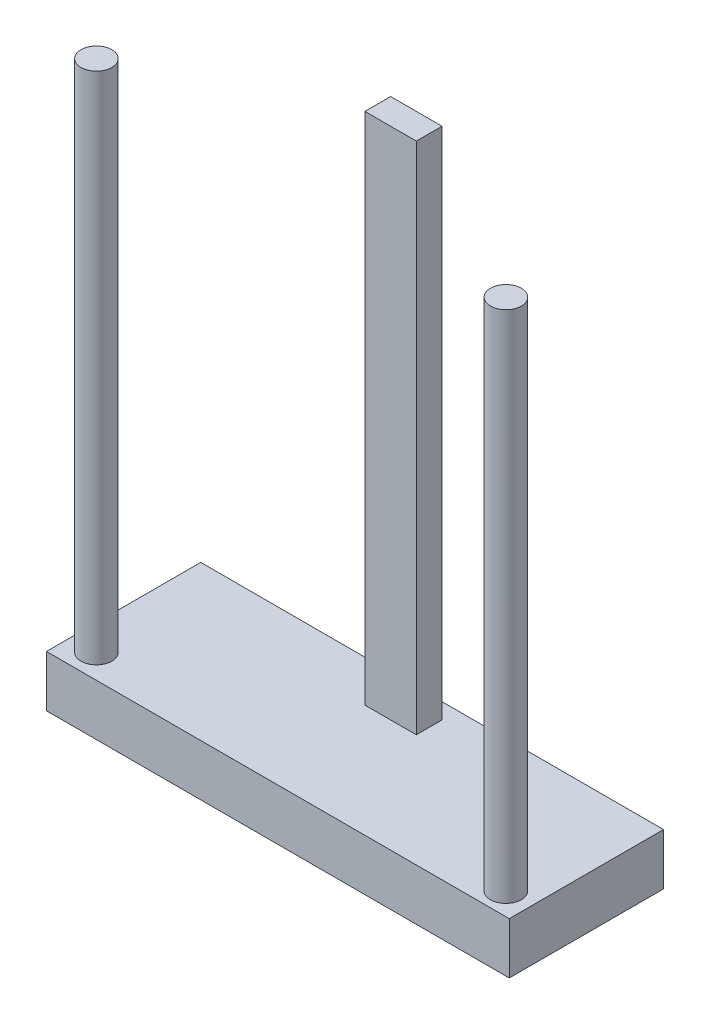
ISO-10303-21;
HEADER;
FILE_DESCRIPTION(('STEP AP214'),'2;1');
FILE_NAME('part.step','',(''),(''),'','','');
FILE_SCHEMA(('AUTOMOTIVE_DESIGN { 1 0 10303 214 1 1 1 1 }'));
ENDSEC;
DATA;
#1=APPLICATION_CONTEXT('core data for automotive mechanical design processes');
#2=APPLICATION_PROTOCOL_DEFINITION('international standard','automotive_design',2000,#1);
#3=PRODUCT_CONTEXT('',#1,'mechanical');
#4=PRODUCT('Part','Part','',(#3));
#5=PRODUCT_RELATED_PRODUCT_CATEGORY('part','',(#4));
#6=PRODUCT_DEFINITION_FORMATION('','',#4);
#7=PRODUCT_DEFINITION_CONTEXT('part definition',#1,'design');
#8=PRODUCT_DEFINITION('design','',#6,#7);
#9=PRODUCT_DEFINITION_SHAPE('','',#8);
#10=(LENGTH_UNIT() NAMED_UNIT(*) SI_UNIT(.MILLI.,.METRE.));
#11=(NAMED_UNIT(*) PLANE_ANGLE_UNIT() SI_UNIT($,.RADIAN.));
#12=(NAMED_UNIT(*) SI_UNIT($,.STERADIAN.) SOLID_ANGLE_UNIT());
#13=UNCERTAINTY_MEASURE_WITH_UNIT(LENGTH_MEASURE(1.E-05),#10,'distance_accuracy_value','');
#14=(GEOMETRIC_REPRESENTATION_CONTEXT(3) GLOBAL_UNCERTAINTY_ASSIGNED_CONTEXT((#13)) GLOBAL_UNIT_ASSIGNED_CONTEXT((#10,
#11,#12)) REPRESENTATION_CONTEXT('',''));
#15=CARTESIAN_POINT('',(0.,0.,0.));
#16=DIRECTION('',(0.,0.,1.));
#17=DIRECTION('',(1.,0.,0.));
#18=AXIS2_PLACEMENT_3D('',#15,#16,#17);
#19=CARTESIAN_POINT('',(0.,25.4,0.));
#20=DIRECTION('',(0.,-1.,0.));
#21=DIRECTION('',(0.,0.,-1.));
#22=AXIS2_PLACEMENT_3D('',#19,#20,#21);
#23=PLANE('',#22);
#24=DIRECTION('',(0.,0.,1.));
#25=VECTOR('',#24,1.);
#26=CARTESIAN_POINT('',(-114.3,25.4,11.9665653495441));
#27=LINE('',#26,#25);
#28=CARTESIAN_POINT('',(-114.3,25.4,-64.2334346504559));
#29=VERTEX_POINT('',#28);
#30=CARTESIAN_POINT('',(-114.3,25.4,11.9665653495441));
#31=VERTEX_POINT('',#30);
#32=EDGE_CURVE('E134',#29,#31,#27,.T.);
#33=ORIENTED_EDGE('',*,*,#32,.T.);
#34=DIRECTION('',(1.,0.,0.));
#35=VECTOR('',#34,1.);
#36=CARTESIAN_POINT('',(-114.3,25.4,11.9665653495441));
#37=LINE('',#36,#35);
#38=CARTESIAN_POINT('',(114.3,25.4,11.9665653495441));
#39=VERTEX_POINT('',#38);
#40=EDGE_CURVE('E137',#31,#39,#37,.T.);
#41=ORIENTED_EDGE('',*,*,#40,.T.);
#42=DIRECTION('',(0.,0.,-1.));
#43=VECTOR('',#42,1.);
#44=CARTESIAN_POINT('',(114.3,25.4,11.9665653495441));
#45=LINE('',#44,#43);
#46=CARTESIAN_POINT('',(114.3,25.4,-64.2334346504559));
#47=VERTEX_POINT('',#46);
#48=EDGE_CURVE('E140',#39,#47,#45,.T.);
#49=ORIENTED_EDGE('',*,*,#48,.T.);
#50=DIRECTION('',(-1.,0.,0.));
#51=VECTOR('',#50,1.);
#52=CARTESIAN_POINT('',(-114.3,25.4,-64.2334346504559));
#53=LINE('',#52,#51);
#54=EDGE_CURVE('E142',#47,#29,#53,.T.);
#55=ORIENTED_EDGE('',*,*,#54,.T.);
#56=EDGE_LOOP('',(#33,#41,#49,#55));
#57=FACE_BOUND('',#56,.T.);
#58=CARTESIAN_POINT('',(-101.6,25.4,0.));
#59=DIRECTION('',(0.,-1.,0.));
#60=DIRECTION('',(0.,0.,-1.));
#61=AXIS2_PLACEMENT_3D('',#58,#59,#60);
#62=CIRCLE('',#61,7.62);
#63=CARTESIAN_POINT('',(-101.6,25.4,-7.61999999999993));
#64=VERTEX_POINT('',#63);
#65=EDGE_CURVE('E44',#64,#64,#62,.F.);
#66=ORIENTED_EDGE('',*,*,#65,.F.);
#67=EDGE_LOOP('',(#66));
#68=FACE_BOUND('',#67,.T.);
#69=CARTESIAN_POINT('',(101.6,25.4,0.915640228086544));
#70=DIRECTION('',(0.,-1.,0.));
#71=DIRECTION('',(0.,0.,-1.));
#72=AXIS2_PLACEMENT_3D('',#69,#70,#71);
#73=CIRCLE('',#72,7.62);
#74=CARTESIAN_POINT('',(101.6,25.4,-6.70435977191346));
#75=VERTEX_POINT('',#74);
#76=EDGE_CURVE('E11',#75,#75,#73,.F.);
#77=ORIENTED_EDGE('',*,*,#76,.F.);
#78=EDGE_LOOP('',(#77));
#79=FACE_BOUND('',#78,.T.);
#80=DIRECTION('',(0.,0.,1.));
#81=VECTOR('',#80,1.);
#82=CARTESIAN_POINT('',(-12.7,25.4,-43.7189494069023));
#83=LINE('',#82,#81);
#84=CARTESIAN_POINT('',(-12.7,25.4,-56.4189494069023));
#85=VERTEX_POINT('',#84);
#86=CARTESIAN_POINT('',(-12.7,25.4,-43.7189494069023));
#87=VERTEX_POINT('',#86);
#88=EDGE_CURVE('E121',#85,#87,#83,.T.);
#89=ORIENTED_EDGE('',*,*,#88,.F.);
#90=DIRECTION('',(-1.,0.,0.));
#91=VECTOR('',#90,1.);
#92=CARTESIAN_POINT('',(-12.7,25.4,-56.4189494069023));
#93=LINE('',#92,#91);
#94=CARTESIAN_POINT('',(12.7,25.4,-56.4189494069023));
#95=VERTEX_POINT('',#94);
#96=EDGE_CURVE('E118',#95,#85,#93,.T.);
#97=ORIENTED_EDGE('',*,*,#96,.F.);
#98=DIRECTION('',(0.,0.,-1.));
#99=VECTOR('',#98,1.);
#100=CARTESIAN_POINT('',(12.7,25.4,-43.7189494069023));
#101=LINE('',#100,#99);
#102=CARTESIAN_POINT('',(12.7,25.4,-43.7189494069023));
#103=VERTEX_POINT('',#102);
#104=EDGE_CURVE('E56',#103,#95,#101,.T.);
#105=ORIENTED_EDGE('',*,*,#104,.F.);
#106=DIRECTION('',(1.,0.,0.));
#107=VECTOR('',#106,1.);
#108=CARTESIAN_POINT('',(-12.7,25.4,-43.7189494069023));
#109=LINE('',#108,#107);
#110=EDGE_CURVE('E51',#87,#103,#109,.T.);
#111=ORIENTED_EDGE('',*,*,#110,.F.);
#112=EDGE_LOOP('',(#89,#97,#105,#111));
#113=FACE_BOUND('',#112,.T.);
#114=ADVANCED_FACE('F36',(#57,#68,#79,#113),#23,.F.);
#115=CARTESIAN_POINT('',(-114.3,25.4,11.9665653495441));
#116=DIRECTION('',(1.,0.,0.));
#117=DIRECTION('',(0.,0.,-1.));
#118=AXIS2_PLACEMENT_3D('',#115,#116,#117);
#119=PLANE('',#118);
#120=DIRECTION('',(0.,0.,1.));
#121=VECTOR('',#120,1.);
#122=CARTESIAN_POINT('',(-114.3,0.,11.9665653495441));
#123=LINE('',#122,#121);
#124=CARTESIAN_POINT('',(-114.3,0.,-64.2334346504559));
#125=VERTEX_POINT('',#124);
#126=CARTESIAN_POINT('',(-114.3,0.,11.9665653495441));
#127=VERTEX_POINT('',#126);
#128=EDGE_CURVE('E133',#125,#127,#123,.T.);
#129=ORIENTED_EDGE('',*,*,#128,.T.);
#130=DIRECTION('',(0.,-1.,0.));
#131=VECTOR('',#130,1.);
#132=CARTESIAN_POINT('',(-114.3,25.4,11.9665653495441));
#133=LINE('',#132,#131);
#134=EDGE_CURVE('E160',#31,#127,#133,.T.);
#135=ORIENTED_EDGE('',*,*,#134,.F.);
#136=ORIENTED_EDGE('',*,*,#32,.F.);
#137=DIRECTION('',(0.,-1.,0.));
#138=VECTOR('',#137,1.);
#139=CARTESIAN_POINT('',(-114.3,25.4,-64.2334346504559));
#140=LINE('',#139,#138);
#141=EDGE_CURVE('E144',#29,#125,#140,.T.);
#142=ORIENTED_EDGE('',*,*,#141,.T.);
#143=EDGE_LOOP('',(#129,#135,#136,#142));
#144=FACE_BOUND('',#143,.T.);
#145=ADVANCED_FACE('F38',(#144),#119,.F.);
#146=CARTESIAN_POINT('',(-114.3,25.4,11.9665653495441));
#147=DIRECTION('',(0.,0.,-1.));
#148=DIRECTION('',(-1.,0.,0.));
#149=AXIS2_PLACEMENT_3D('',#146,#147,#148);
#150=PLANE('',#149);
#151=DIRECTION('',(1.,0.,0.));
#152=VECTOR('',#151,1.);
#153=CARTESIAN_POINT('',(-114.3,0.,11.9665653495441));
#154=LINE('',#153,#152);
#155=CARTESIAN_POINT('',(114.3,0.,11.9665653495441));
#156=VERTEX_POINT('',#155);
#157=EDGE_CURVE('E147',#127,#156,#154,.T.);
#158=ORIENTED_EDGE('',*,*,#157,.T.);
#159=DIRECTION('',(0.,-1.,0.));
#160=VECTOR('',#159,1.);
#161=CARTESIAN_POINT('',(114.3,25.4,11.9665653495441));
#162=LINE('',#161,#160);
#163=EDGE_CURVE('E157',#39,#156,#162,.T.);
#164=ORIENTED_EDGE('',*,*,#163,.F.);
#165=ORIENTED_EDGE('',*,*,#40,.F.);
#166=ORIENTED_EDGE('',*,*,#134,.T.);
#167=EDGE_LOOP('',(#158,#164,#165,#166));
#168=FACE_BOUND('',#167,.T.);
#169=ADVANCED_FACE('F224',(#168),#150,.F.);
#170=CARTESIAN_POINT('',(114.3,25.4,11.9665653495441));
#171=DIRECTION('',(-1.,0.,0.));
#172=DIRECTION('',(0.,0.,1.));
#173=AXIS2_PLACEMENT_3D('',#170,#171,#172);
#174=PLANE('',#173);
#175=DIRECTION('',(0.,0.,-1.));
#176=VECTOR('',#175,1.);
#177=CARTESIAN_POINT('',(114.3,0.,11.9665653495441));
#178=LINE('',#177,#176);
#179=CARTESIAN_POINT('',(114.3,0.,-64.2334346504559));
#180=VERTEX_POINT('',#179);
#181=EDGE_CURVE('E149',#156,#180,#178,.T.);
#182=ORIENTED_EDGE('',*,*,#181,.T.);
#183=DIRECTION('',(0.,-1.,0.));
#184=VECTOR('',#183,1.);
#185=CARTESIAN_POINT('',(114.3,25.4,-64.2334346504559));
#186=LINE('',#185,#184);
#187=EDGE_CURVE('E154',#47,#180,#186,.T.);
#188=ORIENTED_EDGE('',*,*,#187,.F.);
#189=ORIENTED_EDGE('',*,*,#48,.F.);
#190=ORIENTED_EDGE('',*,*,#163,.T.);
#191=EDGE_LOOP('',(#182,#188,#189,#190));
#192=FACE_BOUND('',#191,.T.);
#193=ADVANCED_FACE('F221',(#192),#174,.F.);
#194=CARTESIAN_POINT('',(-114.3,25.4,-64.2334346504559));
#195=DIRECTION('',(0.,0.,1.));
#196=DIRECTION('',(1.,0.,0.));
#197=AXIS2_PLACEMENT_3D('',#194,#195,#196);
#198=PLANE('',#197);
#199=DIRECTION('',(-1.,0.,0.));
#200=VECTOR('',#199,1.);
#201=CARTESIAN_POINT('',(-114.3,0.,-64.2334346504559));
#202=LINE('',#201,#200);
#203=EDGE_CURVE('E138',#180,#125,#202,.T.);
#204=ORIENTED_EDGE('',*,*,#203,.T.);
#205=ORIENTED_EDGE('',*,*,#141,.F.);
#206=ORIENTED_EDGE('',*,*,#54,.F.);
#207=ORIENTED_EDGE('',*,*,#187,.T.);
#208=EDGE_LOOP('',(#204,#205,#206,#207));
#209=FACE_BOUND('',#208,.T.);
#210=ADVANCED_FACE('F217',(#209),#198,.F.);
#211=CARTESIAN_POINT('',(0.,0.,0.));
#212=DIRECTION('',(0.,-1.,0.));
#213=DIRECTION('',(0.,0.,-1.));
#214=AXIS2_PLACEMENT_3D('',#211,#212,#213);
#215=PLANE('',#214);
#216=ORIENTED_EDGE('',*,*,#128,.F.);
#217=ORIENTED_EDGE('',*,*,#203,.F.);
#218=ORIENTED_EDGE('',*,*,#181,.F.);
#219=ORIENTED_EDGE('',*,*,#157,.F.);
#220=EDGE_LOOP('',(#216,#217,#218,#219));
#221=FACE_BOUND('',#220,.T.);
#222=ADVANCED_FACE('F212',(#221),#215,.T.);
#223=CARTESIAN_POINT('',(-101.6,279.4,0.));
#224=DIRECTION('',(0.,-1.,0.));
#225=DIRECTION('',(0.,0.,-1.));
#226=AXIS2_PLACEMENT_3D('',#223,#224,#225);
#227=CYLINDRICAL_SURFACE('',#226,7.62);
#228=CARTESIAN_POINT('',(-101.6,279.4,0.));
#229=DIRECTION('',(0.,1.,0.));
#230=DIRECTION('',(0.,0.,1.));
#231=AXIS2_PLACEMENT_3D('',#228,#229,#230);
#232=CIRCLE('',#231,7.62);
#233=CARTESIAN_POINT('',(-101.6,279.4,7.62000000000007));
#234=VERTEX_POINT('',#233);
#235=EDGE_CURVE('E125',#234,#234,#232,.T.);
#236=ORIENTED_EDGE('',*,*,#235,.F.);
#237=EDGE_LOOP('',(#236));
#238=FACE_BOUND('',#237,.T.);
#239=ORIENTED_EDGE('',*,*,#65,.T.);
#240=EDGE_LOOP('',(#239));
#241=FACE_BOUND('',#240,.T.);
#242=ADVANCED_FACE('F165',(#238,#241),#227,.T.);
#243=CARTESIAN_POINT('',(-101.6,279.4,0.));
#244=DIRECTION('',(0.,1.,0.));
#245=DIRECTION('',(0.,0.,1.));
#246=AXIS2_PLACEMENT_3D('',#243,#244,#245);
#247=PLANE('',#246);
#248=ORIENTED_EDGE('',*,*,#235,.T.);
#249=EDGE_LOOP('',(#248));
#250=FACE_BOUND('',#249,.T.);
#251=ADVANCED_FACE('F206',(#250),#247,.T.);
#252=CARTESIAN_POINT('',(101.6,279.4,0.915640228086544));
#253=DIRECTION('',(0.,-1.,0.));
#254=DIRECTION('',(0.,0.,-1.));
#255=AXIS2_PLACEMENT_3D('',#252,#253,#254);
#256=CYLINDRICAL_SURFACE('',#255,7.62);
#257=CARTESIAN_POINT('',(101.6,279.4,0.915640228086544));
#258=DIRECTION('',(0.,1.,0.));
#259=DIRECTION('',(0.,0.,1.));
#260=AXIS2_PLACEMENT_3D('',#257,#258,#259);
#261=CIRCLE('',#260,7.62);
#262=CARTESIAN_POINT('',(101.6,279.4,8.53564022808654));
#263=VERTEX_POINT('',#262);
#264=EDGE_CURVE('E122',#263,#263,#261,.T.);
#265=ORIENTED_EDGE('',*,*,#264,.F.);
#266=EDGE_LOOP('',(#265));
#267=FACE_BOUND('',#266,.T.);
#268=ORIENTED_EDGE('',*,*,#76,.T.);
#269=EDGE_LOOP('',(#268));
#270=FACE_BOUND('',#269,.T.);
#271=ADVANCED_FACE('F202',(#267,#270),#256,.T.);
#272=CARTESIAN_POINT('',(101.6,279.4,0.915640228086544));
#273=DIRECTION('',(0.,1.,0.));
#274=DIRECTION('',(0.,0.,1.));
#275=AXIS2_PLACEMENT_3D('',#272,#273,#274);
#276=PLANE('',#275);
#277=ORIENTED_EDGE('',*,*,#264,.T.);
#278=EDGE_LOOP('',(#277));
#279=FACE_BOUND('',#278,.T.);
#280=ADVANCED_FACE('F199',(#279),#276,.T.);
#281=CARTESIAN_POINT('',(-12.7,279.4,-43.7189494069023));
#282=DIRECTION('',(1.,0.,0.));
#283=DIRECTION('',(0.,0.,-1.));
#284=AXIS2_PLACEMENT_3D('',#281,#282,#283);
#285=PLANE('',#284);
#286=ORIENTED_EDGE('',*,*,#88,.T.);
#287=DIRECTION('',(0.,-1.,0.));
#288=VECTOR('',#287,1.);
#289=CARTESIAN_POINT('',(-12.7,279.4,-43.7189494069023));
#290=LINE('',#289,#288);
#291=CARTESIAN_POINT('',(-12.7,279.4,-43.7189494069023));
#292=VERTEX_POINT('',#291);
#293=EDGE_CURVE('E102',#292,#87,#290,.T.);
#294=ORIENTED_EDGE('',*,*,#293,.F.);
#295=DIRECTION('',(0.,0.,1.));
#296=VECTOR('',#295,1.);
#297=CARTESIAN_POINT('',(-12.7,279.4,-43.7189494069023));
#298=LINE('',#297,#296);
#299=CARTESIAN_POINT('',(-12.7,279.4,-56.4189494069023));
#300=VERTEX_POINT('',#299);
#301=EDGE_CURVE('E109',#300,#292,#298,.T.);
#302=ORIENTED_EDGE('',*,*,#301,.F.);
#303=DIRECTION('',(0.,-1.,0.));
#304=VECTOR('',#303,1.);
#305=CARTESIAN_POINT('',(-12.7,279.4,-56.4189494069023));
#306=LINE('',#305,#304);
#307=EDGE_CURVE('E177',#300,#85,#306,.T.);
#308=ORIENTED_EDGE('',*,*,#307,.T.);
#309=EDGE_LOOP('',(#286,#294,#302,#308));
#310=FACE_BOUND('',#309,.T.);
#311=ADVANCED_FACE('F120',(#310),#285,.F.);
#312=CARTESIAN_POINT('',(-12.7,279.4,-43.7189494069023));
#313=DIRECTION('',(0.,0.,-1.));
#314=DIRECTION('',(-1.,0.,0.));
#315=AXIS2_PLACEMENT_3D('',#312,#313,#314);
#316=PLANE('',#315);
#317=ORIENTED_EDGE('',*,*,#110,.T.);
#318=DIRECTION('',(0.,-1.,0.));
#319=VECTOR('',#318,1.);
#320=CARTESIAN_POINT('',(12.7,279.4,-43.7189494069023));
#321=LINE('',#320,#319);
#322=CARTESIAN_POINT('',(12.7,279.4,-43.7189494069023));
#323=VERTEX_POINT('',#322);
#324=EDGE_CURVE('E105',#323,#103,#321,.T.);
#325=ORIENTED_EDGE('',*,*,#324,.F.);
#326=DIRECTION('',(1.,0.,0.));
#327=VECTOR('',#326,1.);
#328=CARTESIAN_POINT('',(-12.7,279.4,-43.7189494069023));
#329=LINE('',#328,#327);
#330=EDGE_CURVE('E98',#292,#323,#329,.T.);
#331=ORIENTED_EDGE('',*,*,#330,.F.);
#332=ORIENTED_EDGE('',*,*,#293,.T.);
#333=EDGE_LOOP('',(#317,#325,#331,#332));
#334=FACE_BOUND('',#333,.T.);
#335=ADVANCED_FACE('F100',(#334),#316,.F.);
#336=CARTESIAN_POINT('',(12.7,279.4,-43.7189494069023));
#337=DIRECTION('',(-1.,0.,0.));
#338=DIRECTION('',(0.,0.,1.));
#339=AXIS2_PLACEMENT_3D('',#336,#337,#338);
#340=PLANE('',#339);
#341=ORIENTED_EDGE('',*,*,#104,.T.);
#342=DIRECTION('',(0.,-1.,0.));
#343=VECTOR('',#342,1.);
#344=CARTESIAN_POINT('',(12.7,279.4,-56.4189494069023));
#345=LINE('',#344,#343);
#346=CARTESIAN_POINT('',(12.7,279.4,-56.4189494069023));
#347=VERTEX_POINT('',#346);
#348=EDGE_CURVE('E127',#347,#95,#345,.T.);
#349=ORIENTED_EDGE('',*,*,#348,.F.);
#350=DIRECTION('',(0.,0.,-1.));
#351=VECTOR('',#350,1.);
#352=CARTESIAN_POINT('',(12.7,279.4,-43.7189494069023));
#353=LINE('',#352,#351);
#354=EDGE_CURVE('E108',#323,#347,#353,.T.);
#355=ORIENTED_EDGE('',*,*,#354,.F.);
#356=ORIENTED_EDGE('',*,*,#324,.T.);
#357=EDGE_LOOP('',(#341,#349,#355,#356));
#358=FACE_BOUND('',#357,.T.);
#359=ADVANCED_FACE('F186',(#358),#340,.F.);
#360=CARTESIAN_POINT('',(-12.7,279.4,-56.4189494069023));
#361=DIRECTION('',(0.,0.,1.));
#362=DIRECTION('',(1.,0.,0.));
#363=AXIS2_PLACEMENT_3D('',#360,#361,#362);
#364=PLANE('',#363);
#365=ORIENTED_EDGE('',*,*,#96,.T.);
#366=ORIENTED_EDGE('',*,*,#307,.F.);
#367=DIRECTION('',(-1.,0.,0.));
#368=VECTOR('',#367,1.);
#369=CARTESIAN_POINT('',(-12.7,279.4,-56.4189494069023));
#370=LINE('',#369,#368);
#371=EDGE_CURVE('E114',#347,#300,#370,.T.);
#372=ORIENTED_EDGE('',*,*,#371,.F.);
#373=ORIENTED_EDGE('',*,*,#348,.T.);
#374=EDGE_LOOP('',(#365,#366,#372,#373));
#375=FACE_BOUND('',#374,.T.);
#376=ADVANCED_FACE('F176',(#375),#364,.F.);
#377=CARTESIAN_POINT('',(0.,279.4,0.));
#378=DIRECTION('',(0.,-1.,0.));
#379=DIRECTION('',(0.,0.,-1.));
#380=AXIS2_PLACEMENT_3D('',#377,#378,#379);
#381=PLANE('',#380);
#382=ORIENTED_EDGE('',*,*,#301,.T.);
#383=ORIENTED_EDGE('',*,*,#330,.T.);
#384=ORIENTED_EDGE('',*,*,#354,.T.);
#385=ORIENTED_EDGE('',*,*,#371,.T.);
#386=EDGE_LOOP('',(#382,#383,#384,#385));
#387=FACE_BOUND('',#386,.T.);
#388=ADVANCED_FACE('F112',(#387),#381,.F.);
#389=CLOSED_SHELL('',(#114,#145,#169,#193,#210,#222,#242,#251,#271,#280,#311,#335,#359,#376,#388));
#390=MANIFOLD_SOLID_BREP('B2',#389);
#391=ADVANCED_BREP_SHAPE_REPRESENTATION('',(#18,#390),#14);
#392=SHAPE_DEFINITION_REPRESENTATION(#9,#391);
ENDSEC;
END-ISO-10303-21;
